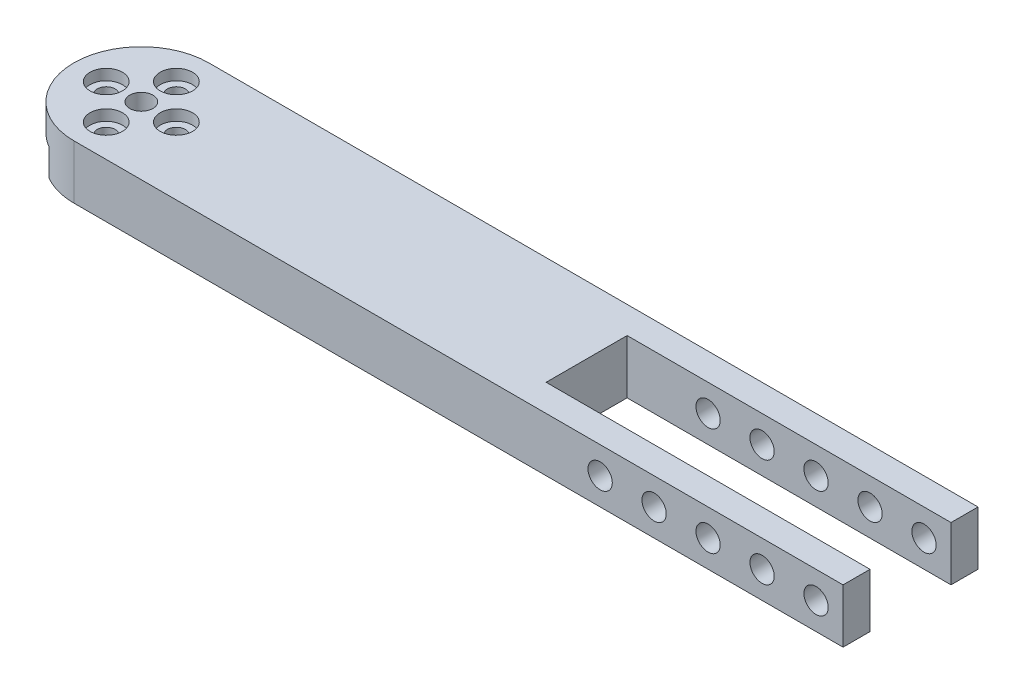
ISO-10303-21;
HEADER;
FILE_DESCRIPTION(('STEP AP214'),'2;1');
FILE_NAME('part.step','',(''),(''),'','','');
FILE_SCHEMA(('AUTOMOTIVE_DESIGN { 1 0 10303 214 1 1 1 1 }'));
ENDSEC;
DATA;
#1=APPLICATION_CONTEXT('core data for automotive mechanical design processes');
#2=APPLICATION_PROTOCOL_DEFINITION('international standard','automotive_design',2000,#1);
#3=PRODUCT_CONTEXT('',#1,'mechanical');
#4=PRODUCT('Part','Part','',(#3));
#5=PRODUCT_RELATED_PRODUCT_CATEGORY('part','',(#4));
#6=PRODUCT_DEFINITION_FORMATION('','',#4);
#7=PRODUCT_DEFINITION_CONTEXT('part definition',#1,'design');
#8=PRODUCT_DEFINITION('design','',#6,#7);
#9=PRODUCT_DEFINITION_SHAPE('','',#8);
#10=(LENGTH_UNIT() NAMED_UNIT(*) SI_UNIT(.MILLI.,.METRE.));
#11=(NAMED_UNIT(*) PLANE_ANGLE_UNIT() SI_UNIT($,.RADIAN.));
#12=(NAMED_UNIT(*) SI_UNIT($,.STERADIAN.) SOLID_ANGLE_UNIT());
#13=UNCERTAINTY_MEASURE_WITH_UNIT(LENGTH_MEASURE(1.E-05),#10,'distance_accuracy_value','');
#14=(GEOMETRIC_REPRESENTATION_CONTEXT(3) GLOBAL_UNCERTAINTY_ASSIGNED_CONTEXT((#13)) GLOBAL_UNIT_ASSIGNED_CONTEXT((#10,
#11,#12)) REPRESENTATION_CONTEXT('',''));
#15=CARTESIAN_POINT('',(0.,0.,0.));
#16=DIRECTION('',(0.,0.,1.));
#17=DIRECTION('',(1.,0.,0.));
#18=AXIS2_PLACEMENT_3D('',#15,#16,#17);
#19=CARTESIAN_POINT('',(6.00000000000009,10.001,-12.5000000000001));
#20=DIRECTION('',(0.,-1.,0.));
#21=DIRECTION('',(0.,0.,-1.));
#22=AXIS2_PLACEMENT_3D('',#19,#20,#21);
#23=CYLINDRICAL_SURFACE('',#22,1.65000000000007);
#24=CARTESIAN_POINT('',(6.00000000000009,5.,-12.5000000000001));
#25=DIRECTION('',(0.,-1.,0.));
#26=DIRECTION('',(0.,0.,-1.));
#27=AXIS2_PLACEMENT_3D('',#24,#25,#26);
#28=CIRCLE('',#27,1.65000000000007);
#29=CARTESIAN_POINT('',(6.00000000000009,5.,-14.1500000000002));
#30=VERTEX_POINT('',#29);
#31=EDGE_CURVE('E234',#30,#30,#28,.T.);
#32=ORIENTED_EDGE('',*,*,#31,.T.);
#33=EDGE_LOOP('',(#32));
#34=FACE_BOUND('',#33,.T.);
#35=CARTESIAN_POINT('',(6.00000000000009,8.,-12.5000000000001));
#36=DIRECTION('',(0.,1.,0.));
#37=DIRECTION('',(0.,0.,1.));
#38=AXIS2_PLACEMENT_3D('',#35,#36,#37);
#39=CIRCLE('',#38,1.65000000000007);
#40=CARTESIAN_POINT('',(6.00000000000009,8.,-10.85));
#41=VERTEX_POINT('',#40);
#42=EDGE_CURVE('E226',#41,#41,#39,.F.);
#43=ORIENTED_EDGE('',*,*,#42,.F.);
#44=EDGE_LOOP('',(#43));
#45=FACE_BOUND('',#44,.T.);
#46=ADVANCED_FACE('F42',(#34,#45),#23,.F.);
#47=CARTESIAN_POINT('',(12.5000000000001,10.001,-19.));
#48=DIRECTION('',(0.,-1.,0.));
#49=DIRECTION('',(0.,0.,-1.));
#50=AXIS2_PLACEMENT_3D('',#47,#48,#49);
#51=CYLINDRICAL_SURFACE('',#50,1.65);
#52=CARTESIAN_POINT('',(12.5000000000001,5.,-19.));
#53=DIRECTION('',(0.,-1.,0.));
#54=DIRECTION('',(0.,0.,-1.));
#55=AXIS2_PLACEMENT_3D('',#52,#53,#54);
#56=CIRCLE('',#55,1.65);
#57=CARTESIAN_POINT('',(12.5000000000001,5.,-20.65));
#58=VERTEX_POINT('',#57);
#59=EDGE_CURVE('E242',#58,#58,#56,.T.);
#60=ORIENTED_EDGE('',*,*,#59,.T.);
#61=EDGE_LOOP('',(#60));
#62=FACE_BOUND('',#61,.T.);
#63=CARTESIAN_POINT('',(12.5000000000001,8.,-19.));
#64=DIRECTION('',(0.,1.,0.));
#65=DIRECTION('',(0.,0.,1.));
#66=AXIS2_PLACEMENT_3D('',#63,#64,#65);
#67=CIRCLE('',#66,1.65);
#68=CARTESIAN_POINT('',(12.5000000000001,8.,-17.35));
#69=VERTEX_POINT('',#68);
#70=EDGE_CURVE('E292',#69,#69,#67,.F.);
#71=ORIENTED_EDGE('',*,*,#70,.F.);
#72=EDGE_LOOP('',(#71));
#73=FACE_BOUND('',#72,.T.);
#74=ADVANCED_FACE('F383',(#62,#73),#51,.F.);
#75=CARTESIAN_POINT('',(19.0000000000001,10.001,-12.4999999999999));
#76=DIRECTION('',(0.,-1.,0.));
#77=DIRECTION('',(0.,0.,-1.));
#78=AXIS2_PLACEMENT_3D('',#75,#76,#77);
#79=CYLINDRICAL_SURFACE('',#78,1.65000000000003);
#80=CARTESIAN_POINT('',(19.0000000000001,5.,-12.4999999999999));
#81=DIRECTION('',(0.,-1.,0.));
#82=DIRECTION('',(0.,0.,-1.));
#83=AXIS2_PLACEMENT_3D('',#80,#81,#82);
#84=CIRCLE('',#83,1.65000000000003);
#85=CARTESIAN_POINT('',(19.0000000000001,5.,-14.1499999999999));
#86=VERTEX_POINT('',#85);
#87=EDGE_CURVE('E239',#86,#86,#84,.T.);
#88=ORIENTED_EDGE('',*,*,#87,.T.);
#89=EDGE_LOOP('',(#88));
#90=FACE_BOUND('',#89,.T.);
#91=CARTESIAN_POINT('',(19.0000000000001,8.,-12.4999999999999));
#92=DIRECTION('',(0.,1.,0.));
#93=DIRECTION('',(0.,0.,1.));
#94=AXIS2_PLACEMENT_3D('',#91,#92,#93);
#95=CIRCLE('',#94,1.65000000000003);
#96=CARTESIAN_POINT('',(19.0000000000001,8.,-10.8499999999999));
#97=VERTEX_POINT('',#96);
#98=EDGE_CURVE('E289',#97,#97,#95,.F.);
#99=ORIENTED_EDGE('',*,*,#98,.F.);
#100=EDGE_LOOP('',(#99));
#101=FACE_BOUND('',#100,.T.);
#102=ADVANCED_FACE('F389',(#90,#101),#79,.F.);
#103=CARTESIAN_POINT('',(12.5,10.001,-6.));
#104=DIRECTION('',(0.,-1.,0.));
#105=DIRECTION('',(0.,0.,-1.));
#106=AXIS2_PLACEMENT_3D('',#103,#104,#105);
#107=CYLINDRICAL_SURFACE('',#106,1.65);
#108=CARTESIAN_POINT('',(12.5,5.,-6.));
#109=DIRECTION('',(0.,-1.,0.));
#110=DIRECTION('',(0.,0.,-1.));
#111=AXIS2_PLACEMENT_3D('',#108,#109,#110);
#112=CIRCLE('',#111,1.65);
#113=CARTESIAN_POINT('',(12.5,5.,-7.65));
#114=VERTEX_POINT('',#113);
#115=EDGE_CURVE('E235',#114,#114,#112,.T.);
#116=ORIENTED_EDGE('',*,*,#115,.T.);
#117=EDGE_LOOP('',(#116));
#118=FACE_BOUND('',#117,.T.);
#119=CARTESIAN_POINT('',(12.5,8.,-6.));
#120=DIRECTION('',(0.,1.,0.));
#121=DIRECTION('',(0.,0.,1.));
#122=AXIS2_PLACEMENT_3D('',#119,#120,#121);
#123=CIRCLE('',#122,1.65);
#124=CARTESIAN_POINT('',(12.5,8.,-4.35));
#125=VERTEX_POINT('',#124);
#126=EDGE_CURVE('E198',#125,#125,#123,.F.);
#127=ORIENTED_EDGE('',*,*,#126,.F.);
#128=EDGE_LOOP('',(#127));
#129=FACE_BOUND('',#128,.T.);
#130=ADVANCED_FACE('F408',(#118,#129),#107,.F.);
#131=CARTESIAN_POINT('',(12.5,-0.000999999999999265,-12.5));
#132=DIRECTION('',(0.,1.,0.));
#133=DIRECTION('',(0.,0.,1.));
#134=AXIS2_PLACEMENT_3D('',#131,#132,#133);
#135=CYLINDRICAL_SURFACE('',#134,2.15);
#136=CARTESIAN_POINT('',(12.5,10.,-12.5));
#137=DIRECTION('',(0.,1.,0.));
#138=DIRECTION('',(0.,0.,1.));
#139=AXIS2_PLACEMENT_3D('',#136,#137,#138);
#140=CIRCLE('',#139,2.15);
#141=CARTESIAN_POINT('',(12.5,10.,-10.35));
#142=VERTEX_POINT('',#141);
#143=EDGE_CURVE('E252',#142,#142,#140,.T.);
#144=ORIENTED_EDGE('',*,*,#143,.T.);
#145=EDGE_LOOP('',(#144));
#146=FACE_BOUND('',#145,.T.);
#147=CARTESIAN_POINT('',(12.5,5.,-12.5));
#148=DIRECTION('',(0.,-1.,0.));
#149=DIRECTION('',(0.,0.,-1.));
#150=AXIS2_PLACEMENT_3D('',#147,#148,#149);
#151=CIRCLE('',#150,2.15);
#152=CARTESIAN_POINT('',(12.5,5.,-14.65));
#153=VERTEX_POINT('',#152);
#154=EDGE_CURVE('E249',#153,#153,#151,.F.);
#155=ORIENTED_EDGE('',*,*,#154,.F.);
#156=EDGE_LOOP('',(#155));
#157=FACE_BOUND('',#156,.T.);
#158=ADVANCED_FACE('F404',(#146,#157),#135,.F.);
#159=CARTESIAN_POINT('',(0.,10.,0.));
#160=DIRECTION('',(0.,0.,-1.));
#161=DIRECTION('',(-1.,0.,0.));
#162=AXIS2_PLACEMENT_3D('',#159,#160,#161);
#163=PLANE('',#162);
#164=CARTESIAN_POINT('',(150.,5.,0.));
#165=DIRECTION('',(0.,0.,1.));
#166=DIRECTION('',(1.,0.,0.));
#167=AXIS2_PLACEMENT_3D('',#164,#165,#166);
#168=CIRCLE('',#167,2.25000000000004);
#169=CARTESIAN_POINT('',(152.25,5.,0.));
#170=VERTEX_POINT('',#169);
#171=EDGE_CURVE('E348',#170,#170,#168,.T.);
#172=ORIENTED_EDGE('',*,*,#171,.F.);
#173=EDGE_LOOP('',(#172));
#174=FACE_BOUND('',#173,.T.);
#175=CARTESIAN_POINT('',(140.,4.99999999999993,0.));
#176=DIRECTION('',(0.,0.,1.));
#177=DIRECTION('',(1.,0.,0.));
#178=AXIS2_PLACEMENT_3D('',#175,#176,#177);
#179=CIRCLE('',#178,2.25000000000001);
#180=CARTESIAN_POINT('',(142.25,4.99999999999993,0.));
#181=VERTEX_POINT('',#180);
#182=EDGE_CURVE('E342',#181,#181,#179,.T.);
#183=ORIENTED_EDGE('',*,*,#182,.F.);
#184=EDGE_LOOP('',(#183));
#185=FACE_BOUND('',#184,.T.);
#186=CARTESIAN_POINT('',(130.,4.99999999999986,0.));
#187=DIRECTION('',(0.,0.,1.));
#188=DIRECTION('',(1.,0.,0.));
#189=AXIS2_PLACEMENT_3D('',#186,#187,#188);
#190=CIRCLE('',#189,2.25000000000001);
#191=CARTESIAN_POINT('',(132.25,4.99999999999986,0.));
#192=VERTEX_POINT('',#191);
#193=EDGE_CURVE('E336',#192,#192,#190,.T.);
#194=ORIENTED_EDGE('',*,*,#193,.F.);
#195=EDGE_LOOP('',(#194));
#196=FACE_BOUND('',#195,.T.);
#197=CARTESIAN_POINT('',(120.,4.99999999999979,0.));
#198=DIRECTION('',(0.,0.,1.));
#199=DIRECTION('',(1.,0.,0.));
#200=AXIS2_PLACEMENT_3D('',#197,#198,#199);
#201=CIRCLE('',#200,2.25000000000001);
#202=CARTESIAN_POINT('',(122.25,4.99999999999979,0.));
#203=VERTEX_POINT('',#202);
#204=EDGE_CURVE('E330',#203,#203,#201,.T.);
#205=ORIENTED_EDGE('',*,*,#204,.F.);
#206=EDGE_LOOP('',(#205));
#207=FACE_BOUND('',#206,.T.);
#208=CARTESIAN_POINT('',(110.,4.99999999999972,0.));
#209=DIRECTION('',(0.,0.,1.));
#210=DIRECTION('',(1.,0.,0.));
#211=AXIS2_PLACEMENT_3D('',#208,#209,#210);
#212=CIRCLE('',#211,2.25000000000001);
#213=CARTESIAN_POINT('',(112.25,4.99999999999972,0.));
#214=VERTEX_POINT('',#213);
#215=EDGE_CURVE('E324',#214,#214,#212,.T.);
#216=ORIENTED_EDGE('',*,*,#215,.F.);
#217=EDGE_LOOP('',(#216));
#218=FACE_BOUND('',#217,.T.);
#219=DIRECTION('',(1.,0.,0.));
#220=VECTOR('',#219,1.);
#221=CARTESIAN_POINT('',(0.,0.,0.));
#222=LINE('',#221,#220);
#223=CARTESIAN_POINT('',(12.5,0.,0.));
#224=VERTEX_POINT('',#223);
#225=CARTESIAN_POINT('',(155.,0.,0.));
#226=VERTEX_POINT('',#225);
#227=EDGE_CURVE('E255',#224,#226,#222,.T.);
#228=ORIENTED_EDGE('',*,*,#227,.T.);
#229=DIRECTION('',(0.,1.,0.));
#230=VECTOR('',#229,1.);
#231=CARTESIAN_POINT('',(155.,0.,0.));
#232=LINE('',#231,#230);
#233=CARTESIAN_POINT('',(155.,10.,0.));
#234=VERTEX_POINT('',#233);
#235=EDGE_CURVE('E187',#226,#234,#232,.T.);
#236=ORIENTED_EDGE('',*,*,#235,.T.);
#237=DIRECTION('',(1.,0.,0.));
#238=VECTOR('',#237,1.);
#239=CARTESIAN_POINT('',(0.,10.,0.));
#240=LINE('',#239,#238);
#241=CARTESIAN_POINT('',(12.5,10.,0.));
#242=VERTEX_POINT('',#241);
#243=EDGE_CURVE('E257',#242,#234,#240,.T.);
#244=ORIENTED_EDGE('',*,*,#243,.F.);
#245=DIRECTION('',(0.,-1.,0.));
#246=VECTOR('',#245,1.);
#247=CARTESIAN_POINT('',(12.5,10.,0.));
#248=LINE('',#247,#246);
#249=EDGE_CURVE('E262',#242,#224,#248,.T.);
#250=ORIENTED_EDGE('',*,*,#249,.T.);
#251=EDGE_LOOP('',(#228,#236,#244,#250));
#252=FACE_BOUND('',#251,.T.);
#253=ADVANCED_FACE('F407',(#174,#185,#196,#207,#218,#252),#163,.F.);
#254=CARTESIAN_POINT('',(0.,10.,-25.));
#255=DIRECTION('',(0.,0.,1.));
#256=DIRECTION('',(1.,0.,0.));
#257=AXIS2_PLACEMENT_3D('',#254,#255,#256);
#258=PLANE('',#257);
#259=CARTESIAN_POINT('',(150.,5.,-25.));
#260=DIRECTION('',(0.,0.,1.));
#261=DIRECTION('',(1.,0.,0.));
#262=AXIS2_PLACEMENT_3D('',#259,#260,#261);
#263=CIRCLE('',#262,2.25000000000004);
#264=CARTESIAN_POINT('',(152.25,5.,-25.));
#265=VERTEX_POINT('',#264);
#266=EDGE_CURVE('E301',#265,#265,#263,.T.);
#267=ORIENTED_EDGE('',*,*,#266,.T.);
#268=EDGE_LOOP('',(#267));
#269=FACE_BOUND('',#268,.T.);
#270=CARTESIAN_POINT('',(140.,4.99999999999993,-25.));
#271=DIRECTION('',(0.,0.,1.));
#272=DIRECTION('',(1.,0.,0.));
#273=AXIS2_PLACEMENT_3D('',#270,#271,#272);
#274=CIRCLE('',#273,2.25000000000001);
#275=CARTESIAN_POINT('',(142.25,4.99999999999993,-25.));
#276=VERTEX_POINT('',#275);
#277=EDGE_CURVE('E345',#276,#276,#274,.T.);
#278=ORIENTED_EDGE('',*,*,#277,.T.);
#279=EDGE_LOOP('',(#278));
#280=FACE_BOUND('',#279,.T.);
#281=CARTESIAN_POINT('',(130.,4.99999999999986,-25.));
#282=DIRECTION('',(0.,0.,1.));
#283=DIRECTION('',(1.,0.,0.));
#284=AXIS2_PLACEMENT_3D('',#281,#282,#283);
#285=CIRCLE('',#284,2.25000000000001);
#286=CARTESIAN_POINT('',(132.25,4.99999999999986,-25.));
#287=VERTEX_POINT('',#286);
#288=EDGE_CURVE('E339',#287,#287,#285,.T.);
#289=ORIENTED_EDGE('',*,*,#288,.T.);
#290=EDGE_LOOP('',(#289));
#291=FACE_BOUND('',#290,.T.);
#292=CARTESIAN_POINT('',(120.,4.99999999999979,-25.));
#293=DIRECTION('',(0.,0.,1.));
#294=DIRECTION('',(1.,0.,0.));
#295=AXIS2_PLACEMENT_3D('',#292,#293,#294);
#296=CIRCLE('',#295,2.25000000000001);
#297=CARTESIAN_POINT('',(122.25,4.99999999999979,-25.));
#298=VERTEX_POINT('',#297);
#299=EDGE_CURVE('E333',#298,#298,#296,.T.);
#300=ORIENTED_EDGE('',*,*,#299,.T.);
#301=EDGE_LOOP('',(#300));
#302=FACE_BOUND('',#301,.T.);
#303=CARTESIAN_POINT('',(110.,4.99999999999972,-25.));
#304=DIRECTION('',(0.,0.,1.));
#305=DIRECTION('',(1.,0.,0.));
#306=AXIS2_PLACEMENT_3D('',#303,#304,#305);
#307=CIRCLE('',#306,2.25000000000001);
#308=CARTESIAN_POINT('',(112.25,4.99999999999972,-25.));
#309=VERTEX_POINT('',#308);
#310=EDGE_CURVE('E327',#309,#309,#307,.T.);
#311=ORIENTED_EDGE('',*,*,#310,.T.);
#312=EDGE_LOOP('',(#311));
#313=FACE_BOUND('',#312,.T.);
#314=DIRECTION('',(-1.,0.,0.));
#315=VECTOR('',#314,1.);
#316=CARTESIAN_POINT('',(0.,10.,-25.));
#317=LINE('',#316,#315);
#318=CARTESIAN_POINT('',(155.,10.,-25.));
#319=VERTEX_POINT('',#318);
#320=CARTESIAN_POINT('',(12.5,10.,-25.));
#321=VERTEX_POINT('',#320);
#322=EDGE_CURVE('E260',#319,#321,#317,.T.);
#323=ORIENTED_EDGE('',*,*,#322,.F.);
#324=DIRECTION('',(0.,1.,0.));
#325=VECTOR('',#324,1.);
#326=CARTESIAN_POINT('',(155.,0.,-25.));
#327=LINE('',#326,#325);
#328=CARTESIAN_POINT('',(155.,0.,-25.));
#329=VERTEX_POINT('',#328);
#330=EDGE_CURVE('E184',#329,#319,#327,.T.);
#331=ORIENTED_EDGE('',*,*,#330,.F.);
#332=DIRECTION('',(-1.,0.,0.));
#333=VECTOR('',#332,1.);
#334=CARTESIAN_POINT('',(0.,0.,-25.));
#335=LINE('',#334,#333);
#336=CARTESIAN_POINT('',(12.5,0.,-25.));
#337=VERTEX_POINT('',#336);
#338=EDGE_CURVE('E161',#329,#337,#335,.T.);
#339=ORIENTED_EDGE('',*,*,#338,.T.);
#340=DIRECTION('',(0.,-1.,0.));
#341=VECTOR('',#340,1.);
#342=CARTESIAN_POINT('',(12.5,10.,-25.));
#343=LINE('',#342,#341);
#344=EDGE_CURVE('E278',#337,#321,#343,.F.);
#345=ORIENTED_EDGE('',*,*,#344,.T.);
#346=EDGE_LOOP('',(#323,#331,#339,#345));
#347=FACE_BOUND('',#346,.T.);
#348=ADVANCED_FACE('F354',(#269,#280,#291,#302,#313,#347),#258,.F.);
#349=CARTESIAN_POINT('',(0.,10.,0.));
#350=DIRECTION('',(0.,-1.,0.));
#351=DIRECTION('',(0.,0.,-1.));
#352=AXIS2_PLACEMENT_3D('',#349,#350,#351);
#353=PLANE('',#352);
#354=CARTESIAN_POINT('',(12.5000000000001,10.,-19.));
#355=DIRECTION('',(0.,1.,0.));
#356=DIRECTION('',(0.,0.,1.));
#357=AXIS2_PLACEMENT_3D('',#354,#355,#356);
#358=CIRCLE('',#357,3.);
#359=CARTESIAN_POINT('',(12.5000000000001,10.,-16.));
#360=VERTEX_POINT('',#359);
#361=EDGE_CURVE('E199',#360,#360,#358,.T.);
#362=ORIENTED_EDGE('',*,*,#361,.F.);
#363=EDGE_LOOP('',(#362));
#364=FACE_BOUND('',#363,.T.);
#365=CARTESIAN_POINT('',(19.,10.,-12.4999999999998));
#366=DIRECTION('',(0.,1.,0.));
#367=DIRECTION('',(0.,0.,1.));
#368=AXIS2_PLACEMENT_3D('',#365,#366,#367);
#369=CIRCLE('',#368,3.00000000000001);
#370=CARTESIAN_POINT('',(19.,10.,-9.49999999999983));
#371=VERTEX_POINT('',#370);
#372=EDGE_CURVE('E205',#371,#371,#369,.T.);
#373=ORIENTED_EDGE('',*,*,#372,.F.);
#374=EDGE_LOOP('',(#373));
#375=FACE_BOUND('',#374,.T.);
#376=CARTESIAN_POINT('',(12.4999999999998,10.,-6.));
#377=DIRECTION('',(0.,1.,0.));
#378=DIRECTION('',(0.,0.,1.));
#379=AXIS2_PLACEMENT_3D('',#376,#377,#378);
#380=CIRCLE('',#379,3.);
#381=CARTESIAN_POINT('',(12.4999999999998,10.,-3.));
#382=VERTEX_POINT('',#381);
#383=EDGE_CURVE('E211',#382,#382,#380,.T.);
#384=ORIENTED_EDGE('',*,*,#383,.F.);
#385=EDGE_LOOP('',(#384));
#386=FACE_BOUND('',#385,.T.);
#387=CARTESIAN_POINT('',(5.99999999999998,10.,-12.5000000000002));
#388=DIRECTION('',(0.,1.,0.));
#389=DIRECTION('',(0.,0.,1.));
#390=AXIS2_PLACEMENT_3D('',#387,#388,#389);
#391=CIRCLE('',#390,3.00000000000004);
#392=CARTESIAN_POINT('',(5.99999999999998,10.,-9.50000000000012));
#393=VERTEX_POINT('',#392);
#394=EDGE_CURVE('E186',#393,#393,#391,.T.);
#395=ORIENTED_EDGE('',*,*,#394,.F.);
#396=EDGE_LOOP('',(#395));
#397=FACE_BOUND('',#396,.T.);
#398=ORIENTED_EDGE('',*,*,#143,.F.);
#399=EDGE_LOOP('',(#398));
#400=FACE_BOUND('',#399,.T.);
#401=DIRECTION('',(-1.,0.,0.));
#402=VECTOR('',#401,1.);
#403=CARTESIAN_POINT('',(95.,10.,-20.));
#404=LINE('',#403,#402);
#405=CARTESIAN_POINT('',(155.,10.,-20.));
#406=VERTEX_POINT('',#405);
#407=CARTESIAN_POINT('',(95.,10.,-20.));
#408=VERTEX_POINT('',#407);
#409=EDGE_CURVE('E177',#406,#408,#404,.T.);
#410=ORIENTED_EDGE('',*,*,#409,.F.);
#411=DIRECTION('',(0.,0.,1.));
#412=VECTOR('',#411,1.);
#413=CARTESIAN_POINT('',(155.,10.,-20.));
#414=LINE('',#413,#412);
#415=EDGE_CURVE('E146',#319,#406,#414,.T.);
#416=ORIENTED_EDGE('',*,*,#415,.F.);
#417=ORIENTED_EDGE('',*,*,#322,.T.);
#418=CARTESIAN_POINT('',(12.5,10.,-12.5));
#419=DIRECTION('',(0.,-1.,0.));
#420=DIRECTION('',(0.,0.,-1.));
#421=AXIS2_PLACEMENT_3D('',#418,#419,#420);
#422=CIRCLE('',#421,12.5);
#423=CARTESIAN_POINT('',(0.,10.,-12.5));
#424=VERTEX_POINT('',#423);
#425=EDGE_CURVE('E274',#321,#424,#422,.F.);
#426=ORIENTED_EDGE('',*,*,#425,.T.);
#427=CARTESIAN_POINT('',(12.5,10.,-12.5));
#428=DIRECTION('',(0.,-1.,0.));
#429=DIRECTION('',(0.,0.,-1.));
#430=AXIS2_PLACEMENT_3D('',#427,#428,#429);
#431=CIRCLE('',#430,12.5);
#432=EDGE_CURVE('E276',#424,#242,#431,.F.);
#433=ORIENTED_EDGE('',*,*,#432,.T.);
#434=ORIENTED_EDGE('',*,*,#243,.T.);
#435=DIRECTION('',(0.,0.,1.));
#436=VECTOR('',#435,1.);
#437=CARTESIAN_POINT('',(155.,10.,0.));
#438=LINE('',#437,#436);
#439=CARTESIAN_POINT('',(155.,10.,-5.));
#440=VERTEX_POINT('',#439);
#441=EDGE_CURVE('E162',#440,#234,#438,.T.);
#442=ORIENTED_EDGE('',*,*,#441,.F.);
#443=DIRECTION('',(1.,0.,0.));
#444=VECTOR('',#443,1.);
#445=CARTESIAN_POINT('',(95.,10.,-5.));
#446=LINE('',#445,#444);
#447=CARTESIAN_POINT('',(95.,10.,-5.));
#448=VERTEX_POINT('',#447);
#449=EDGE_CURVE('E164',#448,#440,#446,.T.);
#450=ORIENTED_EDGE('',*,*,#449,.F.);
#451=DIRECTION('',(0.,0.,1.));
#452=VECTOR('',#451,1.);
#453=CARTESIAN_POINT('',(95.,10.,-5.));
#454=LINE('',#453,#452);
#455=EDGE_CURVE('E179',#408,#448,#454,.T.);
#456=ORIENTED_EDGE('',*,*,#455,.F.);
#457=EDGE_LOOP('',(#410,#416,#417,#426,#433,#434,#442,#450,#456));
#458=FACE_BOUND('',#457,.T.);
#459=ADVANCED_FACE('F410',(#364,#375,#386,#397,#400,#458),#353,.F.);
#460=CARTESIAN_POINT('',(0.,0.,0.));
#461=DIRECTION('',(0.,-1.,0.));
#462=DIRECTION('',(0.,0.,-1.));
#463=AXIS2_PLACEMENT_3D('',#460,#461,#462);
#464=PLANE('',#463);
#465=DIRECTION('',(0.,0.,1.));
#466=VECTOR('',#465,1.);
#467=CARTESIAN_POINT('',(155.,0.,-20.));
#468=LINE('',#467,#466);
#469=CARTESIAN_POINT('',(155.,0.,-20.));
#470=VERTEX_POINT('',#469);
#471=EDGE_CURVE('E143',#329,#470,#468,.T.);
#472=ORIENTED_EDGE('',*,*,#471,.T.);
#473=DIRECTION('',(-1.,0.,0.));
#474=VECTOR('',#473,1.);
#475=CARTESIAN_POINT('',(95.,0.,-20.));
#476=LINE('',#475,#474);
#477=CARTESIAN_POINT('',(95.,0.,-20.));
#478=VERTEX_POINT('',#477);
#479=EDGE_CURVE('E154',#470,#478,#476,.T.);
#480=ORIENTED_EDGE('',*,*,#479,.T.);
#481=DIRECTION('',(0.,0.,1.));
#482=VECTOR('',#481,1.);
#483=CARTESIAN_POINT('',(95.,0.,-5.));
#484=LINE('',#483,#482);
#485=CARTESIAN_POINT('',(95.,0.,-5.));
#486=VERTEX_POINT('',#485);
#487=EDGE_CURVE('E59',#478,#486,#484,.T.);
#488=ORIENTED_EDGE('',*,*,#487,.T.);
#489=DIRECTION('',(1.,0.,0.));
#490=VECTOR('',#489,1.);
#491=CARTESIAN_POINT('',(95.,0.,-5.));
#492=LINE('',#491,#490);
#493=CARTESIAN_POINT('',(155.,0.,-5.));
#494=VERTEX_POINT('',#493);
#495=EDGE_CURVE('E171',#486,#494,#492,.T.);
#496=ORIENTED_EDGE('',*,*,#495,.T.);
#497=DIRECTION('',(0.,0.,1.));
#498=VECTOR('',#497,1.);
#499=CARTESIAN_POINT('',(155.,0.,0.));
#500=LINE('',#499,#498);
#501=EDGE_CURVE('E151',#494,#226,#500,.T.);
#502=ORIENTED_EDGE('',*,*,#501,.T.);
#503=ORIENTED_EDGE('',*,*,#227,.F.);
#504=CARTESIAN_POINT('',(12.5,0.,-12.5));
#505=DIRECTION('',(0.,-1.,0.));
#506=DIRECTION('',(0.,0.,-1.));
#507=AXIS2_PLACEMENT_3D('',#504,#505,#506);
#508=CIRCLE('',#507,12.5);
#509=CARTESIAN_POINT('',(6.21844535662158,0.,-1.69296195702768));
#510=VERTEX_POINT('',#509);
#511=EDGE_CURVE('E271',#224,#510,#508,.T.);
#512=ORIENTED_EDGE('',*,*,#511,.T.);
#513=DIRECTION('',(-0.707106781186548,0.,0.707106781186547));
#514=VECTOR('',#513,1.);
#515=CARTESIAN_POINT('',(8.39878066911803,0.,-3.87329726952412));
#516=LINE('',#515,#514);
#517=CARTESIAN_POINT('',(8.06348801001926,0.,-3.53800461042536));
#518=VERTEX_POINT('',#517);
#519=EDGE_CURVE('E224',#518,#510,#516,.T.);
#520=ORIENTED_EDGE('',*,*,#519,.F.);
#521=CARTESIAN_POINT('',(12.5,0.,-12.5));
#522=DIRECTION('',(0.,-1.,0.));
#523=DIRECTION('',(0.,0.,-1.));
#524=AXIS2_PLACEMENT_3D('',#521,#522,#523);
#525=CIRCLE('',#524,10.);
#526=CARTESIAN_POINT('',(3.53800461042536,0.,-8.06348801001926));
#527=VERTEX_POINT('',#526);
#528=EDGE_CURVE('E238',#527,#518,#525,.T.);
#529=ORIENTED_EDGE('',*,*,#528,.F.);
#530=DIRECTION('',(0.707106781186548,0.,-0.707106781186547));
#531=VECTOR('',#530,1.);
#532=CARTESIAN_POINT('',(3.87329726952412,0.,-8.39878066911803));
#533=LINE('',#532,#531);
#534=CARTESIAN_POINT('',(1.69296195702768,0.,-6.21844535662159));
#535=VERTEX_POINT('',#534);
#536=EDGE_CURVE('E221',#535,#527,#533,.T.);
#537=ORIENTED_EDGE('',*,*,#536,.F.);
#538=CARTESIAN_POINT('',(0.,0.,-12.5));
#539=VERTEX_POINT('',#538);
#540=EDGE_CURVE('E270',#535,#539,#508,.T.);
#541=ORIENTED_EDGE('',*,*,#540,.T.);
#542=CARTESIAN_POINT('',(12.5,0.,-12.5));
#543=DIRECTION('',(0.,-1.,0.));
#544=DIRECTION('',(0.,0.,-1.));
#545=AXIS2_PLACEMENT_3D('',#542,#543,#544);
#546=CIRCLE('',#545,12.5);
#547=EDGE_CURVE('E268',#539,#337,#546,.T.);
#548=ORIENTED_EDGE('',*,*,#547,.T.);
#549=ORIENTED_EDGE('',*,*,#338,.F.);
#550=EDGE_LOOP('',(#472,#480,#488,#496,#502,#503,#512,#520,#529,#537,#541,#548,#549));
#551=FACE_BOUND('',#550,.T.);
#552=ADVANCED_FACE('F159',(#551),#464,.T.);
#553=CARTESIAN_POINT('',(12.5,10.,-12.5));
#554=DIRECTION('',(0.,-1.,0.));
#555=DIRECTION('',(0.,0.,-1.));
#556=AXIS2_PLACEMENT_3D('',#553,#554,#555);
#557=CYLINDRICAL_SURFACE('',#556,12.5);
#558=DIRECTION('',(0.,-1.,0.));
#559=VECTOR('',#558,1.);
#560=CARTESIAN_POINT('',(0.,10.,-12.5));
#561=LINE('',#560,#559);
#562=EDGE_CURVE('E256',#424,#539,#561,.T.);
#563=ORIENTED_EDGE('',*,*,#562,.F.);
#564=ORIENTED_EDGE('',*,*,#425,.F.);
#565=ORIENTED_EDGE('',*,*,#344,.F.);
#566=ORIENTED_EDGE('',*,*,#547,.F.);
#567=EDGE_LOOP('',(#563,#564,#565,#566));
#568=FACE_BOUND('',#567,.T.);
#569=ADVANCED_FACE('F44',(#568),#557,.T.);
#570=CARTESIAN_POINT('',(12.5,10.,-12.5));
#571=DIRECTION('',(0.,-1.,0.));
#572=DIRECTION('',(0.,0.,-1.));
#573=AXIS2_PLACEMENT_3D('',#570,#571,#572);
#574=CYLINDRICAL_SURFACE('',#573,12.5);
#575=DIRECTION('',(0.,-1.,0.));
#576=VECTOR('',#575,1.);
#577=CARTESIAN_POINT('',(6.21844535662158,10.,-1.69296195702768));
#578=LINE('',#577,#576);
#579=CARTESIAN_POINT('',(6.21844535662158,5.,-1.69296195702768));
#580=VERTEX_POINT('',#579);
#581=EDGE_CURVE('E231',#510,#580,#578,.F.);
#582=ORIENTED_EDGE('',*,*,#581,.F.);
#583=ORIENTED_EDGE('',*,*,#511,.F.);
#584=ORIENTED_EDGE('',*,*,#249,.F.);
#585=ORIENTED_EDGE('',*,*,#432,.F.);
#586=ORIENTED_EDGE('',*,*,#562,.T.);
#587=ORIENTED_EDGE('',*,*,#540,.F.);
#588=DIRECTION('',(0.,-1.,0.));
#589=VECTOR('',#588,1.);
#590=CARTESIAN_POINT('',(1.69296195702768,10.,-6.21844535662158));
#591=LINE('',#590,#589);
#592=CARTESIAN_POINT('',(1.69296195702768,5.,-6.21844535662158));
#593=VERTEX_POINT('',#592);
#594=EDGE_CURVE('E229',#593,#535,#591,.T.);
#595=ORIENTED_EDGE('',*,*,#594,.F.);
#596=CARTESIAN_POINT('',(12.5,5.,-12.5));
#597=DIRECTION('',(0.,-1.,0.));
#598=DIRECTION('',(0.,0.,-1.));
#599=AXIS2_PLACEMENT_3D('',#596,#597,#598);
#600=CIRCLE('',#599,12.5);
#601=EDGE_CURVE('E223',#593,#580,#600,.F.);
#602=ORIENTED_EDGE('',*,*,#601,.T.);
#603=EDGE_LOOP('',(#582,#583,#584,#585,#586,#587,#595,#602));
#604=FACE_BOUND('',#603,.T.);
#605=ADVANCED_FACE('F399',(#604),#574,.T.);
#606=CARTESIAN_POINT('',(12.5,5.,-12.5));
#607=DIRECTION('',(0.,-1.,0.));
#608=DIRECTION('',(0.,0.,-1.));
#609=AXIS2_PLACEMENT_3D('',#606,#607,#608);
#610=PLANE('',#609);
#611=CARTESIAN_POINT('',(12.5,5.,-12.5));
#612=DIRECTION('',(0.,-1.,0.));
#613=DIRECTION('',(0.,0.,-1.));
#614=AXIS2_PLACEMENT_3D('',#611,#612,#613);
#615=CIRCLE('',#614,10.);
#616=CARTESIAN_POINT('',(3.53800461042536,5.,-8.06348801001926));
#617=VERTEX_POINT('',#616);
#618=CARTESIAN_POINT('',(8.06348801001926,5.,-3.53800461042536));
#619=VERTEX_POINT('',#618);
#620=EDGE_CURVE('E247',#617,#619,#615,.T.);
#621=ORIENTED_EDGE('',*,*,#620,.T.);
#622=DIRECTION('',(0.707106781186548,0.,-0.707106781186547));
#623=VECTOR('',#622,1.);
#624=CARTESIAN_POINT('',(8.39878066911803,5.,-3.87329726952412));
#625=LINE('',#624,#623);
#626=EDGE_CURVE('E220',#580,#619,#625,.T.);
#627=ORIENTED_EDGE('',*,*,#626,.F.);
#628=ORIENTED_EDGE('',*,*,#601,.F.);
#629=DIRECTION('',(-0.707106781186548,0.,0.707106781186547));
#630=VECTOR('',#629,1.);
#631=CARTESIAN_POINT('',(3.87329726952412,5.,-8.39878066911803));
#632=LINE('',#631,#630);
#633=EDGE_CURVE('E67',#617,#593,#632,.T.);
#634=ORIENTED_EDGE('',*,*,#633,.F.);
#635=EDGE_LOOP('',(#621,#627,#628,#634));
#636=FACE_BOUND('',#635,.T.);
#637=ORIENTED_EDGE('',*,*,#115,.F.);
#638=EDGE_LOOP('',(#637));
#639=FACE_BOUND('',#638,.T.);
#640=ORIENTED_EDGE('',*,*,#87,.F.);
#641=EDGE_LOOP('',(#640));
#642=FACE_BOUND('',#641,.T.);
#643=ORIENTED_EDGE('',*,*,#59,.F.);
#644=EDGE_LOOP('',(#643));
#645=FACE_BOUND('',#644,.T.);
#646=ORIENTED_EDGE('',*,*,#31,.F.);
#647=EDGE_LOOP('',(#646));
#648=FACE_BOUND('',#647,.T.);
#649=ORIENTED_EDGE('',*,*,#154,.T.);
#650=EDGE_LOOP('',(#649));
#651=FACE_BOUND('',#650,.T.);
#652=ADVANCED_FACE('F395',(#636,#639,#642,#645,#648,#651),#610,.T.);
#653=CARTESIAN_POINT('',(12.5,5.,-12.5));
#654=DIRECTION('',(0.,-1.,0.));
#655=DIRECTION('',(0.,0.,-1.));
#656=AXIS2_PLACEMENT_3D('',#653,#654,#655);
#657=CYLINDRICAL_SURFACE('',#656,10.);
#658=ORIENTED_EDGE('',*,*,#528,.T.);
#659=DIRECTION('',(0.,-1.,0.));
#660=VECTOR('',#659,1.);
#661=CARTESIAN_POINT('',(8.06348801001926,5.,-3.53800461042536));
#662=LINE('',#661,#660);
#663=EDGE_CURVE('E12',#518,#619,#662,.F.);
#664=ORIENTED_EDGE('',*,*,#663,.T.);
#665=ORIENTED_EDGE('',*,*,#620,.F.);
#666=DIRECTION('',(0.,-1.,0.));
#667=VECTOR('',#666,1.);
#668=CARTESIAN_POINT('',(3.53800461042536,5.,-8.06348801001926));
#669=LINE('',#668,#667);
#670=EDGE_CURVE('E51',#617,#527,#669,.T.);
#671=ORIENTED_EDGE('',*,*,#670,.T.);
#672=EDGE_LOOP('',(#658,#664,#665,#671));
#673=FACE_BOUND('',#672,.T.);
#674=ADVANCED_FACE('F398',(#673),#657,.F.);
#675=CARTESIAN_POINT('',(8.39878066911803,14.9,-3.87329726952412));
#676=DIRECTION('',(0.707106781186547,0.,0.707106781186548));
#677=DIRECTION('',(0.707106781186548,0.,-0.707106781186547));
#678=AXIS2_PLACEMENT_3D('',#675,#676,#677);
#679=PLANE('',#678);
#680=ORIENTED_EDGE('',*,*,#581,.T.);
#681=ORIENTED_EDGE('',*,*,#626,.T.);
#682=ORIENTED_EDGE('',*,*,#663,.F.);
#683=ORIENTED_EDGE('',*,*,#519,.T.);
#684=EDGE_LOOP('',(#680,#681,#682,#683));
#685=FACE_BOUND('',#684,.T.);
#686=ADVANCED_FACE('F402',(#685),#679,.F.);
#687=CARTESIAN_POINT('',(3.87329726952412,14.9,-8.39878066911803));
#688=DIRECTION('',(-0.707106781186547,0.,-0.707106781186548));
#689=DIRECTION('',(-0.707106781186548,0.,0.707106781186547));
#690=AXIS2_PLACEMENT_3D('',#687,#688,#689);
#691=PLANE('',#690);
#692=ORIENTED_EDGE('',*,*,#594,.T.);
#693=ORIENTED_EDGE('',*,*,#536,.T.);
#694=ORIENTED_EDGE('',*,*,#670,.F.);
#695=ORIENTED_EDGE('',*,*,#633,.T.);
#696=EDGE_LOOP('',(#692,#693,#694,#695));
#697=FACE_BOUND('',#696,.T.);
#698=ADVANCED_FACE('F448',(#697),#691,.F.);
#699=CARTESIAN_POINT('',(12.4999999999998,8.,-6.));
#700=DIRECTION('',(0.,1.,0.));
#701=DIRECTION('',(0.,0.,1.));
#702=AXIS2_PLACEMENT_3D('',#699,#700,#701);
#703=PLANE('',#702);
#704=CARTESIAN_POINT('',(12.4999999999998,8.,-6.));
#705=DIRECTION('',(0.,1.,0.));
#706=DIRECTION('',(0.,0.,1.));
#707=AXIS2_PLACEMENT_3D('',#704,#705,#706);
#708=CIRCLE('',#707,3.);
#709=CARTESIAN_POINT('',(12.4999999999998,8.,-3.));
#710=VERTEX_POINT('',#709);
#711=EDGE_CURVE('E208',#710,#710,#708,.T.);
#712=ORIENTED_EDGE('',*,*,#711,.T.);
#713=EDGE_LOOP('',(#712));
#714=FACE_BOUND('',#713,.T.);
#715=ORIENTED_EDGE('',*,*,#126,.T.);
#716=EDGE_LOOP('',(#715));
#717=FACE_BOUND('',#716,.T.);
#718=ADVANCED_FACE('F456',(#714,#717),#703,.T.);
#719=CARTESIAN_POINT('',(12.4999999999998,8.,-6.));
#720=DIRECTION('',(0.,1.,0.));
#721=DIRECTION('',(0.,0.,1.));
#722=AXIS2_PLACEMENT_3D('',#719,#720,#721);
#723=CYLINDRICAL_SURFACE('',#722,3.);
#724=ORIENTED_EDGE('',*,*,#711,.F.);
#725=EDGE_LOOP('',(#724));
#726=FACE_BOUND('',#725,.T.);
#727=ORIENTED_EDGE('',*,*,#383,.T.);
#728=EDGE_LOOP('',(#727));
#729=FACE_BOUND('',#728,.T.);
#730=ADVANCED_FACE('F473',(#726,#729),#723,.F.);
#731=CARTESIAN_POINT('',(19.,8.,-12.4999999999998));
#732=DIRECTION('',(0.,1.,0.));
#733=DIRECTION('',(0.,0.,1.));
#734=AXIS2_PLACEMENT_3D('',#731,#732,#733);
#735=PLANE('',#734);
#736=CARTESIAN_POINT('',(19.,8.,-12.4999999999998));
#737=DIRECTION('',(0.,1.,0.));
#738=DIRECTION('',(0.,0.,1.));
#739=AXIS2_PLACEMENT_3D('',#736,#737,#738);
#740=CIRCLE('',#739,3.00000000000001);
#741=CARTESIAN_POINT('',(19.,8.,-9.49999999999983));
#742=VERTEX_POINT('',#741);
#743=EDGE_CURVE('E202',#742,#742,#740,.T.);
#744=ORIENTED_EDGE('',*,*,#743,.T.);
#745=EDGE_LOOP('',(#744));
#746=FACE_BOUND('',#745,.T.);
#747=ORIENTED_EDGE('',*,*,#98,.T.);
#748=EDGE_LOOP('',(#747));
#749=FACE_BOUND('',#748,.T.);
#750=ADVANCED_FACE('F470',(#746,#749),#735,.T.);
#751=CARTESIAN_POINT('',(19.,8.,-12.4999999999998));
#752=DIRECTION('',(0.,1.,0.));
#753=DIRECTION('',(0.,0.,1.));
#754=AXIS2_PLACEMENT_3D('',#751,#752,#753);
#755=CYLINDRICAL_SURFACE('',#754,3.00000000000001);
#756=ORIENTED_EDGE('',*,*,#743,.F.);
#757=EDGE_LOOP('',(#756));
#758=FACE_BOUND('',#757,.T.);
#759=ORIENTED_EDGE('',*,*,#372,.T.);
#760=EDGE_LOOP('',(#759));
#761=FACE_BOUND('',#760,.T.);
#762=ADVANCED_FACE('F472',(#758,#761),#755,.F.);
#763=CARTESIAN_POINT('',(12.5000000000001,8.,-19.));
#764=DIRECTION('',(0.,1.,0.));
#765=DIRECTION('',(0.,0.,1.));
#766=AXIS2_PLACEMENT_3D('',#763,#764,#765);
#767=PLANE('',#766);
#768=CARTESIAN_POINT('',(12.5000000000001,8.,-19.));
#769=DIRECTION('',(0.,1.,0.));
#770=DIRECTION('',(0.,0.,1.));
#771=AXIS2_PLACEMENT_3D('',#768,#769,#770);
#772=CIRCLE('',#771,3.);
#773=CARTESIAN_POINT('',(12.5000000000001,8.,-16.));
#774=VERTEX_POINT('',#773);
#775=EDGE_CURVE('E195',#774,#774,#772,.T.);
#776=ORIENTED_EDGE('',*,*,#775,.T.);
#777=EDGE_LOOP('',(#776));
#778=FACE_BOUND('',#777,.T.);
#779=ORIENTED_EDGE('',*,*,#70,.T.);
#780=EDGE_LOOP('',(#779));
#781=FACE_BOUND('',#780,.T.);
#782=ADVANCED_FACE('F480',(#778,#781),#767,.T.);
#783=CARTESIAN_POINT('',(12.5000000000001,8.,-19.));
#784=DIRECTION('',(0.,1.,0.));
#785=DIRECTION('',(0.,0.,1.));
#786=AXIS2_PLACEMENT_3D('',#783,#784,#785);
#787=CYLINDRICAL_SURFACE('',#786,3.);
#788=ORIENTED_EDGE('',*,*,#775,.F.);
#789=EDGE_LOOP('',(#788));
#790=FACE_BOUND('',#789,.T.);
#791=ORIENTED_EDGE('',*,*,#361,.T.);
#792=EDGE_LOOP('',(#791));
#793=FACE_BOUND('',#792,.T.);
#794=ADVANCED_FACE('F486',(#790,#793),#787,.F.);
#795=CARTESIAN_POINT('',(5.99999999999998,8.,-12.5000000000002));
#796=DIRECTION('',(0.,1.,0.));
#797=DIRECTION('',(0.,0.,1.));
#798=AXIS2_PLACEMENT_3D('',#795,#796,#797);
#799=PLANE('',#798);
#800=CARTESIAN_POINT('',(5.99999999999998,8.,-12.5000000000002));
#801=DIRECTION('',(0.,1.,0.));
#802=DIRECTION('',(0.,0.,1.));
#803=AXIS2_PLACEMENT_3D('',#800,#801,#802);
#804=CIRCLE('',#803,3.00000000000004);
#805=CARTESIAN_POINT('',(5.99999999999998,8.,-9.50000000000012));
#806=VERTEX_POINT('',#805);
#807=EDGE_CURVE('E214',#806,#806,#804,.T.);
#808=ORIENTED_EDGE('',*,*,#807,.T.);
#809=EDGE_LOOP('',(#808));
#810=FACE_BOUND('',#809,.T.);
#811=ORIENTED_EDGE('',*,*,#42,.T.);
#812=EDGE_LOOP('',(#811));
#813=FACE_BOUND('',#812,.T.);
#814=ADVANCED_FACE('F492',(#810,#813),#799,.T.);
#815=CARTESIAN_POINT('',(5.99999999999998,8.,-12.5000000000002));
#816=DIRECTION('',(0.,1.,0.));
#817=DIRECTION('',(0.,0.,1.));
#818=AXIS2_PLACEMENT_3D('',#815,#816,#817);
#819=CYLINDRICAL_SURFACE('',#818,3.00000000000004);
#820=ORIENTED_EDGE('',*,*,#807,.F.);
#821=EDGE_LOOP('',(#820));
#822=FACE_BOUND('',#821,.T.);
#823=ORIENTED_EDGE('',*,*,#394,.T.);
#824=EDGE_LOOP('',(#823));
#825=FACE_BOUND('',#824,.T.);
#826=ADVANCED_FACE('F494',(#822,#825),#819,.F.);
#827=CARTESIAN_POINT('',(155.,0.,-20.));
#828=DIRECTION('',(-1.,0.,0.));
#829=DIRECTION('',(0.,0.,1.));
#830=AXIS2_PLACEMENT_3D('',#827,#828,#829);
#831=PLANE('',#830);
#832=ORIENTED_EDGE('',*,*,#415,.T.);
#833=DIRECTION('',(0.,1.,0.));
#834=VECTOR('',#833,1.);
#835=CARTESIAN_POINT('',(155.,0.,-20.));
#836=LINE('',#835,#834);
#837=EDGE_CURVE('E139',#470,#406,#836,.T.);
#838=ORIENTED_EDGE('',*,*,#837,.F.);
#839=ORIENTED_EDGE('',*,*,#471,.F.);
#840=ORIENTED_EDGE('',*,*,#330,.T.);
#841=EDGE_LOOP('',(#832,#838,#839,#840));
#842=FACE_BOUND('',#841,.T.);
#843=ADVANCED_FACE('F141',(#842),#831,.F.);
#844=CARTESIAN_POINT('',(155.,0.,0.));
#845=DIRECTION('',(-1.,0.,0.));
#846=DIRECTION('',(0.,0.,1.));
#847=AXIS2_PLACEMENT_3D('',#844,#845,#846);
#848=PLANE('',#847);
#849=ORIENTED_EDGE('',*,*,#441,.T.);
#850=ORIENTED_EDGE('',*,*,#235,.F.);
#851=ORIENTED_EDGE('',*,*,#501,.F.);
#852=DIRECTION('',(0.,1.,0.));
#853=VECTOR('',#852,1.);
#854=CARTESIAN_POINT('',(155.,0.,-5.));
#855=LINE('',#854,#853);
#856=EDGE_CURVE('E190',#494,#440,#855,.T.);
#857=ORIENTED_EDGE('',*,*,#856,.T.);
#858=EDGE_LOOP('',(#849,#850,#851,#857));
#859=FACE_BOUND('',#858,.T.);
#860=ADVANCED_FACE('F501',(#859),#848,.F.);
#861=CARTESIAN_POINT('',(95.,0.,-5.));
#862=DIRECTION('',(0.,0.,1.));
#863=DIRECTION('',(1.,0.,0.));
#864=AXIS2_PLACEMENT_3D('',#861,#862,#863);
#865=PLANE('',#864);
#866=CARTESIAN_POINT('',(150.,5.,-5.));
#867=DIRECTION('',(0.,0.,1.));
#868=DIRECTION('',(1.,0.,0.));
#869=AXIS2_PLACEMENT_3D('',#866,#867,#868);
#870=CIRCLE('',#869,2.25000000000004);
#871=CARTESIAN_POINT('',(152.25,5.,-5.));
#872=VERTEX_POINT('',#871);
#873=EDGE_CURVE('E167',#872,#872,#870,.T.);
#874=ORIENTED_EDGE('',*,*,#873,.T.);
#875=EDGE_LOOP('',(#874));
#876=FACE_BOUND('',#875,.T.);
#877=CARTESIAN_POINT('',(140.,4.99999999999993,-5.));
#878=DIRECTION('',(0.,0.,1.));
#879=DIRECTION('',(1.,0.,0.));
#880=AXIS2_PLACEMENT_3D('',#877,#878,#879);
#881=CIRCLE('',#880,2.25000000000001);
#882=CARTESIAN_POINT('',(142.25,4.99999999999993,-5.));
#883=VERTEX_POINT('',#882);
#884=EDGE_CURVE('E311',#883,#883,#881,.T.);
#885=ORIENTED_EDGE('',*,*,#884,.T.);
#886=EDGE_LOOP('',(#885));
#887=FACE_BOUND('',#886,.T.);
#888=CARTESIAN_POINT('',(130.,4.99999999999986,-5.));
#889=DIRECTION('',(0.,0.,1.));
#890=DIRECTION('',(1.,0.,0.));
#891=AXIS2_PLACEMENT_3D('',#888,#889,#890);
#892=CIRCLE('',#891,2.25000000000001);
#893=CARTESIAN_POINT('',(132.25,4.99999999999986,-5.));
#894=VERTEX_POINT('',#893);
#895=EDGE_CURVE('E308',#894,#894,#892,.T.);
#896=ORIENTED_EDGE('',*,*,#895,.T.);
#897=EDGE_LOOP('',(#896));
#898=FACE_BOUND('',#897,.T.);
#899=CARTESIAN_POINT('',(120.,4.99999999999979,-5.));
#900=DIRECTION('',(0.,0.,1.));
#901=DIRECTION('',(1.,0.,0.));
#902=AXIS2_PLACEMENT_3D('',#899,#900,#901);
#903=CIRCLE('',#902,2.25000000000001);
#904=CARTESIAN_POINT('',(122.25,4.99999999999979,-5.));
#905=VERTEX_POINT('',#904);
#906=EDGE_CURVE('E305',#905,#905,#903,.T.);
#907=ORIENTED_EDGE('',*,*,#906,.T.);
#908=EDGE_LOOP('',(#907));
#909=FACE_BOUND('',#908,.T.);
#910=CARTESIAN_POINT('',(110.,4.99999999999972,-5.));
#911=DIRECTION('',(0.,0.,1.));
#912=DIRECTION('',(1.,0.,0.));
#913=AXIS2_PLACEMENT_3D('',#910,#911,#912);
#914=CIRCLE('',#913,2.25000000000001);
#915=CARTESIAN_POINT('',(112.25,4.99999999999972,-5.));
#916=VERTEX_POINT('',#915);
#917=EDGE_CURVE('E300',#916,#916,#914,.T.);
#918=ORIENTED_EDGE('',*,*,#917,.T.);
#919=EDGE_LOOP('',(#918));
#920=FACE_BOUND('',#919,.T.);
#921=ORIENTED_EDGE('',*,*,#449,.T.);
#922=ORIENTED_EDGE('',*,*,#856,.F.);
#923=ORIENTED_EDGE('',*,*,#495,.F.);
#924=DIRECTION('',(0.,1.,0.));
#925=VECTOR('',#924,1.);
#926=CARTESIAN_POINT('',(95.,0.,-5.));
#927=LINE('',#926,#925);
#928=EDGE_CURVE('E192',#486,#448,#927,.T.);
#929=ORIENTED_EDGE('',*,*,#928,.T.);
#930=EDGE_LOOP('',(#921,#922,#923,#929));
#931=FACE_BOUND('',#930,.T.);
#932=ADVANCED_FACE('F370',(#876,#887,#898,#909,#920,#931),#865,.F.);
#933=CARTESIAN_POINT('',(95.,0.,-5.));
#934=DIRECTION('',(-1.,0.,0.));
#935=DIRECTION('',(0.,0.,1.));
#936=AXIS2_PLACEMENT_3D('',#933,#934,#935);
#937=PLANE('',#936);
#938=ORIENTED_EDGE('',*,*,#455,.T.);
#939=ORIENTED_EDGE('',*,*,#928,.F.);
#940=ORIENTED_EDGE('',*,*,#487,.F.);
#941=DIRECTION('',(0.,1.,0.));
#942=VECTOR('',#941,1.);
#943=CARTESIAN_POINT('',(95.,0.,-20.));
#944=LINE('',#943,#942);
#945=EDGE_CURVE('E150',#478,#408,#944,.T.);
#946=ORIENTED_EDGE('',*,*,#945,.T.);
#947=EDGE_LOOP('',(#938,#939,#940,#946));
#948=FACE_BOUND('',#947,.T.);
#949=ADVANCED_FACE('F580',(#948),#937,.F.);
#950=CARTESIAN_POINT('',(95.,0.,-20.));
#951=DIRECTION('',(0.,0.,-1.));
#952=DIRECTION('',(-1.,0.,0.));
#953=AXIS2_PLACEMENT_3D('',#950,#951,#952);
#954=PLANE('',#953);
#955=CARTESIAN_POINT('',(150.,5.,-20.));
#956=DIRECTION('',(0.,0.,-1.));
#957=DIRECTION('',(-1.,0.,0.));
#958=AXIS2_PLACEMENT_3D('',#955,#956,#957);
#959=CIRCLE('',#958,2.25000000000004);
#960=CARTESIAN_POINT('',(147.75,5.,-20.));
#961=VERTEX_POINT('',#960);
#962=EDGE_CURVE('E46',#961,#961,#959,.T.);
#963=ORIENTED_EDGE('',*,*,#962,.T.);
#964=EDGE_LOOP('',(#963));
#965=FACE_BOUND('',#964,.T.);
#966=CARTESIAN_POINT('',(140.,4.99999999999993,-20.));
#967=DIRECTION('',(0.,0.,-1.));
#968=DIRECTION('',(-1.,0.,0.));
#969=AXIS2_PLACEMENT_3D('',#966,#967,#968);
#970=CIRCLE('',#969,2.25000000000001);
#971=CARTESIAN_POINT('',(137.75,4.99999999999993,-20.));
#972=VERTEX_POINT('',#971);
#973=EDGE_CURVE('E309',#972,#972,#970,.T.);
#974=ORIENTED_EDGE('',*,*,#973,.T.);
#975=EDGE_LOOP('',(#974));
#976=FACE_BOUND('',#975,.T.);
#977=CARTESIAN_POINT('',(130.,4.99999999999986,-20.));
#978=DIRECTION('',(0.,0.,-1.));
#979=DIRECTION('',(-1.,0.,0.));
#980=AXIS2_PLACEMENT_3D('',#977,#978,#979);
#981=CIRCLE('',#980,2.25000000000001);
#982=CARTESIAN_POINT('',(127.75,4.99999999999986,-20.));
#983=VERTEX_POINT('',#982);
#984=EDGE_CURVE('E306',#983,#983,#981,.T.);
#985=ORIENTED_EDGE('',*,*,#984,.T.);
#986=EDGE_LOOP('',(#985));
#987=FACE_BOUND('',#986,.T.);
#988=CARTESIAN_POINT('',(120.,4.99999999999979,-20.));
#989=DIRECTION('',(0.,0.,-1.));
#990=DIRECTION('',(-1.,0.,0.));
#991=AXIS2_PLACEMENT_3D('',#988,#989,#990);
#992=CIRCLE('',#991,2.25000000000001);
#993=CARTESIAN_POINT('',(117.75,4.99999999999979,-20.));
#994=VERTEX_POINT('',#993);
#995=EDGE_CURVE('E302',#994,#994,#992,.T.);
#996=ORIENTED_EDGE('',*,*,#995,.T.);
#997=EDGE_LOOP('',(#996));
#998=FACE_BOUND('',#997,.T.);
#999=CARTESIAN_POINT('',(110.,4.99999999999972,-20.));
#1000=DIRECTION('',(0.,0.,-1.));
#1001=DIRECTION('',(-1.,0.,0.));
#1002=AXIS2_PLACEMENT_3D('',#999,#1000,#1001);
#1003=CIRCLE('',#1002,2.25000000000001);
#1004=CARTESIAN_POINT('',(107.75,4.99999999999972,-20.));
#1005=VERTEX_POINT('',#1004);
#1006=EDGE_CURVE('E297',#1005,#1005,#1003,.T.);
#1007=ORIENTED_EDGE('',*,*,#1006,.T.);
#1008=EDGE_LOOP('',(#1007));
#1009=FACE_BOUND('',#1008,.T.);
#1010=ORIENTED_EDGE('',*,*,#409,.T.);
#1011=ORIENTED_EDGE('',*,*,#945,.F.);
#1012=ORIENTED_EDGE('',*,*,#479,.F.);
#1013=ORIENTED_EDGE('',*,*,#837,.T.);
#1014=EDGE_LOOP('',(#1010,#1011,#1012,#1013));
#1015=FACE_BOUND('',#1014,.T.);
#1016=ADVANCED_FACE('F155',(#965,#976,#987,#998,#1009,#1015),#954,.F.);
#1017=CARTESIAN_POINT('',(110.,4.99999999999972,-25.));
#1018=DIRECTION('',(0.,0.,1.));
#1019=DIRECTION('',(1.,0.,0.));
#1020=AXIS2_PLACEMENT_3D('',#1017,#1018,#1019);
#1021=CYLINDRICAL_SURFACE('',#1020,2.25000000000001);
#1022=ORIENTED_EDGE('',*,*,#310,.F.);
#1023=EDGE_LOOP('',(#1022));
#1024=FACE_BOUND('',#1023,.T.);
#1025=ORIENTED_EDGE('',*,*,#1006,.F.);
#1026=EDGE_LOOP('',(#1025));
#1027=FACE_BOUND('',#1026,.T.);
#1028=ADVANCED_FACE('F609',(#1024,#1027),#1021,.F.);
#1029=CARTESIAN_POINT('',(120.,4.99999999999979,-25.));
#1030=DIRECTION('',(0.,0.,1.));
#1031=DIRECTION('',(1.,0.,0.));
#1032=AXIS2_PLACEMENT_3D('',#1029,#1030,#1031);
#1033=CYLINDRICAL_SURFACE('',#1032,2.25000000000001);
#1034=ORIENTED_EDGE('',*,*,#299,.F.);
#1035=EDGE_LOOP('',(#1034));
#1036=FACE_BOUND('',#1035,.T.);
#1037=ORIENTED_EDGE('',*,*,#995,.F.);
#1038=EDGE_LOOP('',(#1037));
#1039=FACE_BOUND('',#1038,.T.);
#1040=ADVANCED_FACE('F617',(#1036,#1039),#1033,.F.);
#1041=CARTESIAN_POINT('',(130.,4.99999999999986,-25.));
#1042=DIRECTION('',(0.,0.,1.));
#1043=DIRECTION('',(1.,0.,0.));
#1044=AXIS2_PLACEMENT_3D('',#1041,#1042,#1043);
#1045=CYLINDRICAL_SURFACE('',#1044,2.25000000000001);
#1046=ORIENTED_EDGE('',*,*,#288,.F.);
#1047=EDGE_LOOP('',(#1046));
#1048=FACE_BOUND('',#1047,.T.);
#1049=ORIENTED_EDGE('',*,*,#984,.F.);
#1050=EDGE_LOOP('',(#1049));
#1051=FACE_BOUND('',#1050,.T.);
#1052=ADVANCED_FACE('F627',(#1048,#1051),#1045,.F.);
#1053=CARTESIAN_POINT('',(140.,4.99999999999993,-25.));
#1054=DIRECTION('',(0.,0.,1.));
#1055=DIRECTION('',(1.,0.,0.));
#1056=AXIS2_PLACEMENT_3D('',#1053,#1054,#1055);
#1057=CYLINDRICAL_SURFACE('',#1056,2.25000000000001);
#1058=ORIENTED_EDGE('',*,*,#277,.F.);
#1059=EDGE_LOOP('',(#1058));
#1060=FACE_BOUND('',#1059,.T.);
#1061=ORIENTED_EDGE('',*,*,#973,.F.);
#1062=EDGE_LOOP('',(#1061));
#1063=FACE_BOUND('',#1062,.T.);
#1064=ADVANCED_FACE('F361',(#1060,#1063),#1057,.F.);
#1065=CARTESIAN_POINT('',(150.,5.,-25.));
#1066=DIRECTION('',(0.,0.,1.));
#1067=DIRECTION('',(1.,0.,0.));
#1068=AXIS2_PLACEMENT_3D('',#1065,#1066,#1067);
#1069=CYLINDRICAL_SURFACE('',#1068,2.25000000000004);
#1070=ORIENTED_EDGE('',*,*,#266,.F.);
#1071=EDGE_LOOP('',(#1070));
#1072=FACE_BOUND('',#1071,.T.);
#1073=ORIENTED_EDGE('',*,*,#962,.F.);
#1074=EDGE_LOOP('',(#1073));
#1075=FACE_BOUND('',#1074,.T.);
#1076=ADVANCED_FACE('F357',(#1072,#1075),#1069,.F.);
#1077=ORIENTED_EDGE('',*,*,#215,.T.);
#1078=EDGE_LOOP('',(#1077));
#1079=FACE_BOUND('',#1078,.T.);
#1080=ORIENTED_EDGE('',*,*,#917,.F.);
#1081=EDGE_LOOP('',(#1080));
#1082=FACE_BOUND('',#1081,.T.);
#1083=ADVANCED_FACE('F360',(#1079,#1082),#1021,.F.);
#1084=ORIENTED_EDGE('',*,*,#204,.T.);
#1085=EDGE_LOOP('',(#1084));
#1086=FACE_BOUND('',#1085,.T.);
#1087=ORIENTED_EDGE('',*,*,#906,.F.);
#1088=EDGE_LOOP('',(#1087));
#1089=FACE_BOUND('',#1088,.T.);
#1090=ADVANCED_FACE('F630',(#1086,#1089),#1033,.F.);
#1091=ORIENTED_EDGE('',*,*,#193,.T.);
#1092=EDGE_LOOP('',(#1091));
#1093=FACE_BOUND('',#1092,.T.);
#1094=ORIENTED_EDGE('',*,*,#895,.F.);
#1095=EDGE_LOOP('',(#1094));
#1096=FACE_BOUND('',#1095,.T.);
#1097=ADVANCED_FACE('F379',(#1093,#1096),#1045,.F.);
#1098=ORIENTED_EDGE('',*,*,#182,.T.);
#1099=EDGE_LOOP('',(#1098));
#1100=FACE_BOUND('',#1099,.T.);
#1101=ORIENTED_EDGE('',*,*,#884,.F.);
#1102=EDGE_LOOP('',(#1101));
#1103=FACE_BOUND('',#1102,.T.);
#1104=ADVANCED_FACE('F374',(#1100,#1103),#1057,.F.);
#1105=ORIENTED_EDGE('',*,*,#171,.T.);
#1106=EDGE_LOOP('',(#1105));
#1107=FACE_BOUND('',#1106,.T.);
#1108=ORIENTED_EDGE('',*,*,#873,.F.);
#1109=EDGE_LOOP('',(#1108));
#1110=FACE_BOUND('',#1109,.T.);
#1111=ADVANCED_FACE('F363',(#1107,#1110),#1069,.F.);
#1112=CLOSED_SHELL('',(#46,#74,#102,#130,#158,#253,#348,#459,#552,#569,#605,#652,#674,#686,#698,
#718,#730,#750,#762,#782,#794,#814,#826,#843,#860,#932,#949,#1016,#1028,#1040,#1052,#1064,#1076,
#1083,#1090,#1097,#1104,#1111));
#1113=MANIFOLD_SOLID_BREP('B2',#1112);
#1114=ADVANCED_BREP_SHAPE_REPRESENTATION('',(#18,#1113),#14);
#1115=SHAPE_DEFINITION_REPRESENTATION(#9,#1114);
ENDSEC;
END-ISO-10303-21;
